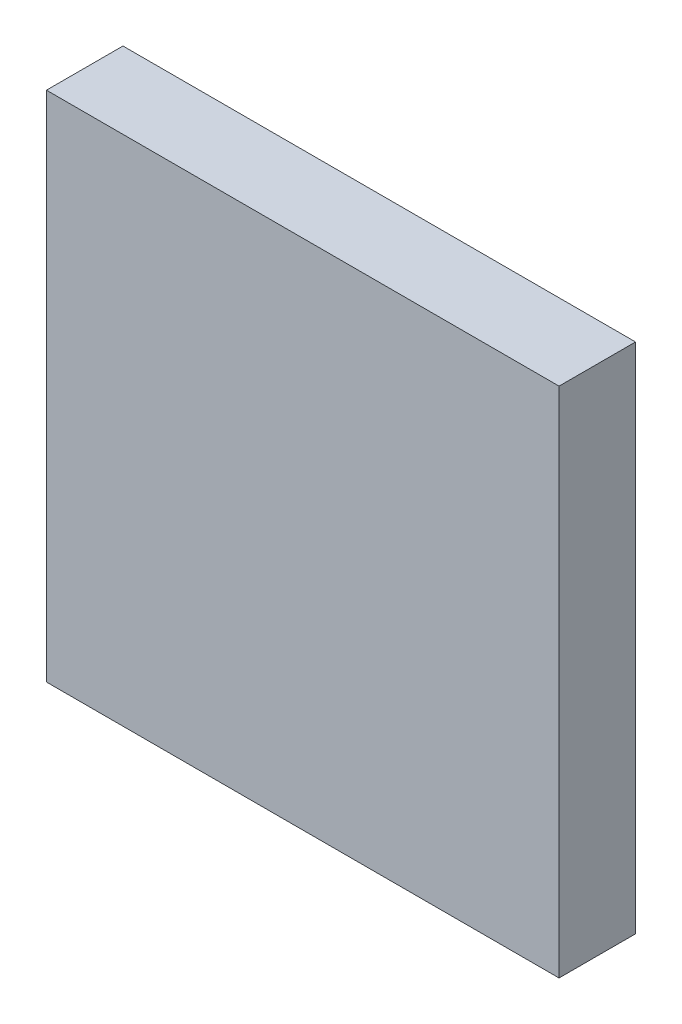
ISO-10303-21;
HEADER;
FILE_DESCRIPTION(('STEP AP214'),'2;1');
FILE_NAME('part.step','',(''),(''),'','','');
FILE_SCHEMA(('AUTOMOTIVE_DESIGN { 1 0 10303 214 1 1 1 1 }'));
ENDSEC;
DATA;
#1=APPLICATION_CONTEXT('core data for automotive mechanical design processes');
#2=APPLICATION_PROTOCOL_DEFINITION('international standard','automotive_design',2000,#1);
#3=PRODUCT_CONTEXT('',#1,'mechanical');
#4=PRODUCT('Part','Part','',(#3));
#5=PRODUCT_RELATED_PRODUCT_CATEGORY('part','',(#4));
#6=PRODUCT_DEFINITION_FORMATION('','',#4);
#7=PRODUCT_DEFINITION_CONTEXT('part definition',#1,'design');
#8=PRODUCT_DEFINITION('design','',#6,#7);
#9=PRODUCT_DEFINITION_SHAPE('','',#8);
#10=(LENGTH_UNIT() NAMED_UNIT(*) SI_UNIT(.MILLI.,.METRE.));
#11=(NAMED_UNIT(*) PLANE_ANGLE_UNIT() SI_UNIT($,.RADIAN.));
#12=(NAMED_UNIT(*) SI_UNIT($,.STERADIAN.) SOLID_ANGLE_UNIT());
#13=UNCERTAINTY_MEASURE_WITH_UNIT(LENGTH_MEASURE(1.E-05),#10,'distance_accuracy_value','');
#14=(GEOMETRIC_REPRESENTATION_CONTEXT(3) GLOBAL_UNCERTAINTY_ASSIGNED_CONTEXT((#13)) GLOBAL_UNIT_ASSIGNED_CONTEXT((#10,
#11,#12)) REPRESENTATION_CONTEXT('',''));
#15=CARTESIAN_POINT('',(0.,0.,0.));
#16=DIRECTION('',(0.,0.,1.));
#17=DIRECTION('',(1.,0.,0.));
#18=AXIS2_PLACEMENT_3D('',#15,#16,#17);
#19=CARTESIAN_POINT('',(3.35000092,-3.34999838,1.00000054));
#20=DIRECTION('',(0.,0.,1.));
#21=DIRECTION('',(1.,0.,0.));
#22=AXIS2_PLACEMENT_3D('',#19,#20,#21);
#23=PLANE('',#22);
#24=DIRECTION('',(0.,1.,0.));
#25=VECTOR('',#24,1.);
#26=CARTESIAN_POINT('',(-3.34999838,-3.34999838,1.00000054));
#27=LINE('',#26,#25);
#28=CARTESIAN_POINT('',(-3.34999838,-3.34999838,1.00000054));
#29=VERTEX_POINT('',#28);
#30=CARTESIAN_POINT('',(-3.34999838,3.35000092,1.00000054));
#31=VERTEX_POINT('',#30);
#32=EDGE_CURVE('E53',#29,#31,#27,.T.);
#33=ORIENTED_EDGE('',*,*,#32,.F.);
#34=DIRECTION('',(1.,0.,0.));
#35=VECTOR('',#34,1.);
#36=CARTESIAN_POINT('',(3.35000092,-3.34999838,1.00000054));
#37=LINE('',#36,#35);
#38=CARTESIAN_POINT('',(3.35000092,-3.34999838,1.00000054));
#39=VERTEX_POINT('',#38);
#40=EDGE_CURVE('E68',#39,#29,#37,.F.);
#41=ORIENTED_EDGE('',*,*,#40,.F.);
#42=DIRECTION('',(0.,1.,0.));
#43=VECTOR('',#42,1.);
#44=CARTESIAN_POINT('',(3.35000092,3.35000092,1.00000054));
#45=LINE('',#44,#43);
#46=CARTESIAN_POINT('',(3.35000092,3.35000092,1.00000054));
#47=VERTEX_POINT('',#46);
#48=EDGE_CURVE('E20',#47,#39,#45,.F.);
#49=ORIENTED_EDGE('',*,*,#48,.F.);
#50=DIRECTION('',(1.,0.,0.));
#51=VECTOR('',#50,1.);
#52=CARTESIAN_POINT('',(-3.34999838,3.35000092,1.00000054));
#53=LINE('',#52,#51);
#54=EDGE_CURVE('E58',#31,#47,#53,.T.);
#55=ORIENTED_EDGE('',*,*,#54,.F.);
#56=EDGE_LOOP('',(#33,#41,#49,#55));
#57=FACE_BOUND('',#56,.T.);
#58=ADVANCED_FACE('F17',(#57),#23,.T.);
#59=CARTESIAN_POINT('',(3.35000092,3.35000092,0.));
#60=DIRECTION('',(1.,0.,0.));
#61=DIRECTION('',(0.,0.,-1.));
#62=AXIS2_PLACEMENT_3D('',#59,#60,#61);
#63=PLANE('',#62);
#64=DIRECTION('',(0.,0.,-1.));
#65=VECTOR('',#64,1.);
#66=CARTESIAN_POINT('',(3.35000092,-3.34999838,0.));
#67=LINE('',#66,#65);
#68=CARTESIAN_POINT('',(3.35000092,-3.34999838,0.));
#69=VERTEX_POINT('',#68);
#70=EDGE_CURVE('E79',#69,#39,#67,.F.);
#71=ORIENTED_EDGE('',*,*,#70,.F.);
#72=DIRECTION('',(0.,1.,0.));
#73=VECTOR('',#72,1.);
#74=CARTESIAN_POINT('',(3.35000092,-3.34999838,0.));
#75=LINE('',#74,#73);
#76=CARTESIAN_POINT('',(3.35000092,3.35000092,0.));
#77=VERTEX_POINT('',#76);
#78=EDGE_CURVE('E74',#69,#77,#75,.T.);
#79=ORIENTED_EDGE('',*,*,#78,.T.);
#80=DIRECTION('',(0.,0.,1.));
#81=VECTOR('',#80,1.);
#82=CARTESIAN_POINT('',(3.35000092,3.35000092,0.));
#83=LINE('',#82,#81);
#84=EDGE_CURVE('E63',#47,#77,#83,.F.);
#85=ORIENTED_EDGE('',*,*,#84,.F.);
#86=ORIENTED_EDGE('',*,*,#48,.T.);
#87=EDGE_LOOP('',(#71,#79,#85,#86));
#88=FACE_BOUND('',#87,.T.);
#89=ADVANCED_FACE('F73',(#88),#63,.T.);
#90=CARTESIAN_POINT('',(-3.34999838,3.35000092,0.));
#91=DIRECTION('',(0.,1.,0.));
#92=DIRECTION('',(0.,0.,1.));
#93=AXIS2_PLACEMENT_3D('',#90,#91,#92);
#94=PLANE('',#93);
#95=ORIENTED_EDGE('',*,*,#84,.T.);
#96=DIRECTION('',(1.,0.,0.));
#97=VECTOR('',#96,1.);
#98=CARTESIAN_POINT('',(3.35000092,3.35000092,0.));
#99=LINE('',#98,#97);
#100=CARTESIAN_POINT('',(-3.34999838,3.35000092,0.));
#101=VERTEX_POINT('',#100);
#102=EDGE_CURVE('E84',#77,#101,#99,.F.);
#103=ORIENTED_EDGE('',*,*,#102,.T.);
#104=DIRECTION('',(0.,0.,1.));
#105=VECTOR('',#104,1.);
#106=CARTESIAN_POINT('',(-3.34999838,3.35000092,0.));
#107=LINE('',#106,#105);
#108=EDGE_CURVE('E65',#31,#101,#107,.F.);
#109=ORIENTED_EDGE('',*,*,#108,.F.);
#110=ORIENTED_EDGE('',*,*,#54,.T.);
#111=EDGE_LOOP('',(#95,#103,#109,#110));
#112=FACE_BOUND('',#111,.T.);
#113=ADVANCED_FACE('F60',(#112),#94,.T.);
#114=CARTESIAN_POINT('',(-3.34999838,-3.34999838,0.));
#115=DIRECTION('',(-1.,0.,0.));
#116=DIRECTION('',(0.,0.,1.));
#117=AXIS2_PLACEMENT_3D('',#114,#115,#116);
#118=PLANE('',#117);
#119=ORIENTED_EDGE('',*,*,#108,.T.);
#120=DIRECTION('',(0.,1.,0.));
#121=VECTOR('',#120,1.);
#122=CARTESIAN_POINT('',(-3.34999838,-3.34999838,0.));
#123=LINE('',#122,#121);
#124=CARTESIAN_POINT('',(-3.34999838,-3.34999838,0.));
#125=VERTEX_POINT('',#124);
#126=EDGE_CURVE('E26',#101,#125,#123,.F.);
#127=ORIENTED_EDGE('',*,*,#126,.T.);
#128=DIRECTION('',(0.,0.,-1.));
#129=VECTOR('',#128,1.);
#130=CARTESIAN_POINT('',(-3.34999838,-3.34999838,0.));
#131=LINE('',#130,#129);
#132=EDGE_CURVE('E34',#29,#125,#131,.T.);
#133=ORIENTED_EDGE('',*,*,#132,.F.);
#134=ORIENTED_EDGE('',*,*,#32,.T.);
#135=EDGE_LOOP('',(#119,#127,#133,#134));
#136=FACE_BOUND('',#135,.T.);
#137=ADVANCED_FACE('F88',(#136),#118,.T.);
#138=CARTESIAN_POINT('',(3.35000092,-3.34999838,0.));
#139=DIRECTION('',(0.,-1.,0.));
#140=DIRECTION('',(0.,0.,-1.));
#141=AXIS2_PLACEMENT_3D('',#138,#139,#140);
#142=PLANE('',#141);
#143=ORIENTED_EDGE('',*,*,#132,.T.);
#144=DIRECTION('',(1.,0.,0.));
#145=VECTOR('',#144,1.);
#146=CARTESIAN_POINT('',(3.35000092,-3.34999838,0.));
#147=LINE('',#146,#145);
#148=EDGE_CURVE('E11',#125,#69,#147,.T.);
#149=ORIENTED_EDGE('',*,*,#148,.T.);
#150=ORIENTED_EDGE('',*,*,#70,.T.);
#151=ORIENTED_EDGE('',*,*,#40,.T.);
#152=EDGE_LOOP('',(#143,#149,#150,#151));
#153=FACE_BOUND('',#152,.T.);
#154=ADVANCED_FACE('F91',(#153),#142,.T.);
#155=CARTESIAN_POINT('',(3.35000092,-3.34999838,0.));
#156=DIRECTION('',(0.,0.,1.));
#157=DIRECTION('',(1.,0.,0.));
#158=AXIS2_PLACEMENT_3D('',#155,#156,#157);
#159=PLANE('',#158);
#160=ORIENTED_EDGE('',*,*,#126,.F.);
#161=ORIENTED_EDGE('',*,*,#102,.F.);
#162=ORIENTED_EDGE('',*,*,#78,.F.);
#163=ORIENTED_EDGE('',*,*,#148,.F.);
#164=EDGE_LOOP('',(#160,#161,#162,#163));
#165=FACE_BOUND('',#164,.T.);
#166=ADVANCED_FACE('F90',(#165),#159,.F.);
#167=CLOSED_SHELL('',(#58,#89,#113,#137,#154,#166));
#168=MANIFOLD_SOLID_BREP('B1',#167);
#169=ADVANCED_BREP_SHAPE_REPRESENTATION('',(#18,#168),#14);
#170=SHAPE_DEFINITION_REPRESENTATION(#9,#169);
ENDSEC;
END-ISO-10303-21;
